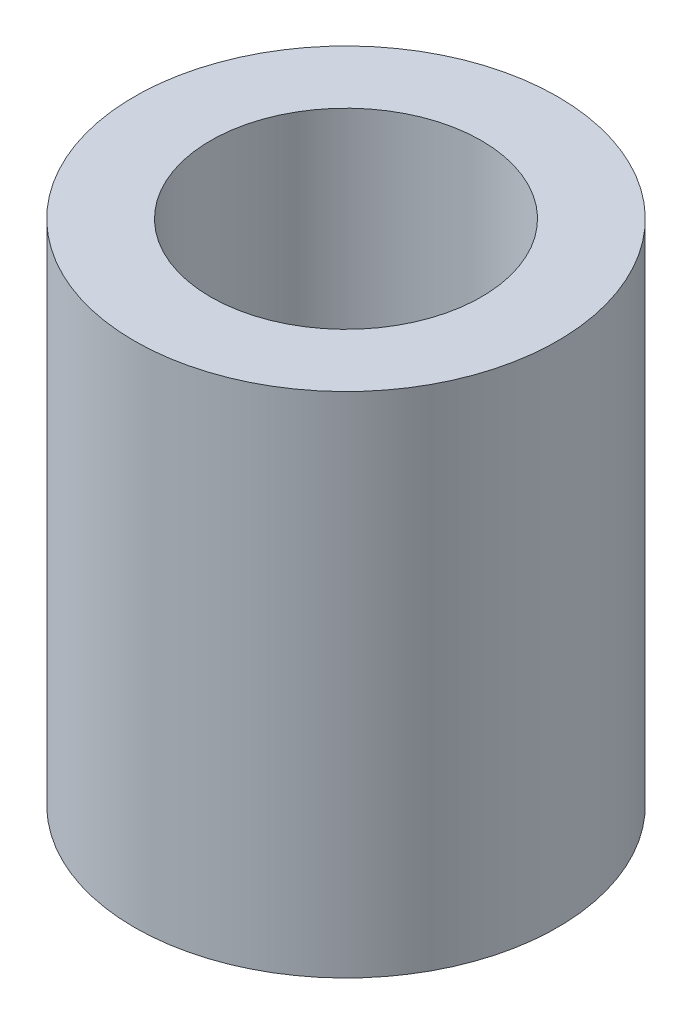
ISO-10303-21;
HEADER;
FILE_DESCRIPTION(('STEP AP214'),'2;1');
FILE_NAME('part.step','',(''),(''),'','','');
FILE_SCHEMA(('AUTOMOTIVE_DESIGN { 1 0 10303 214 1 1 1 1 }'));
ENDSEC;
DATA;
#1=APPLICATION_CONTEXT('core data for automotive mechanical design processes');
#2=APPLICATION_PROTOCOL_DEFINITION('international standard','automotive_design',2000,#1);
#3=PRODUCT_CONTEXT('',#1,'mechanical');
#4=PRODUCT('Part','Part','',(#3));
#5=PRODUCT_RELATED_PRODUCT_CATEGORY('part','',(#4));
#6=PRODUCT_DEFINITION_FORMATION('','',#4);
#7=PRODUCT_DEFINITION_CONTEXT('part definition',#1,'design');
#8=PRODUCT_DEFINITION('design','',#6,#7);
#9=PRODUCT_DEFINITION_SHAPE('','',#8);
#10=(LENGTH_UNIT() NAMED_UNIT(*) SI_UNIT(.MILLI.,.METRE.));
#11=(NAMED_UNIT(*) PLANE_ANGLE_UNIT() SI_UNIT($,.RADIAN.));
#12=(NAMED_UNIT(*) SI_UNIT($,.STERADIAN.) SOLID_ANGLE_UNIT());
#13=UNCERTAINTY_MEASURE_WITH_UNIT(LENGTH_MEASURE(1.E-05),#10,'distance_accuracy_value','');
#14=(GEOMETRIC_REPRESENTATION_CONTEXT(3) GLOBAL_UNCERTAINTY_ASSIGNED_CONTEXT((#13)) GLOBAL_UNIT_ASSIGNED_CONTEXT((#10,
#11,#12)) REPRESENTATION_CONTEXT('',''));
#15=CARTESIAN_POINT('',(0.,0.,0.));
#16=DIRECTION('',(0.,0.,1.));
#17=DIRECTION('',(1.,0.,0.));
#18=AXIS2_PLACEMENT_3D('',#15,#16,#17);
#19=CARTESIAN_POINT('',(0.,3.,0.));
#20=DIRECTION('',(0.,-1.,0.));
#21=DIRECTION('',(0.,0.,-1.));
#22=AXIS2_PLACEMENT_3D('',#19,#20,#21);
#23=CYLINDRICAL_SURFACE('',#22,2.5);
#24=CARTESIAN_POINT('',(0.,3.,0.));
#25=DIRECTION('',(0.,1.,0.));
#26=DIRECTION('',(0.,0.,1.));
#27=AXIS2_PLACEMENT_3D('',#24,#25,#26);
#28=CIRCLE('',#27,2.5);
#29=CARTESIAN_POINT('',(0.,3.,2.5));
#30=VERTEX_POINT('',#29);
#31=EDGE_CURVE('E10',#30,#30,#28,.T.);
#32=ORIENTED_EDGE('',*,*,#31,.F.);
#33=EDGE_LOOP('',(#32));
#34=FACE_BOUND('',#33,.T.);
#35=CARTESIAN_POINT('',(0.,-3.,0.));
#36=DIRECTION('',(0.,1.,0.));
#37=DIRECTION('',(0.,0.,1.));
#38=AXIS2_PLACEMENT_3D('',#35,#36,#37);
#39=CIRCLE('',#38,2.5);
#40=CARTESIAN_POINT('',(0.,-3.,2.5));
#41=VERTEX_POINT('',#40);
#42=EDGE_CURVE('E44',#41,#41,#39,.T.);
#43=ORIENTED_EDGE('',*,*,#42,.T.);
#44=EDGE_LOOP('',(#43));
#45=FACE_BOUND('',#44,.T.);
#46=ADVANCED_FACE('F41',(#34,#45),#23,.T.);
#47=CARTESIAN_POINT('',(0.,3.,0.));
#48=DIRECTION('',(0.,1.,0.));
#49=DIRECTION('',(0.,0.,1.));
#50=AXIS2_PLACEMENT_3D('',#47,#48,#49);
#51=PLANE('',#50);
#52=CARTESIAN_POINT('',(0.,3.,0.));
#53=DIRECTION('',(0.,1.,0.));
#54=DIRECTION('',(0.,0.,1.));
#55=AXIS2_PLACEMENT_3D('',#52,#53,#54);
#56=CIRCLE('',#55,1.6);
#57=CARTESIAN_POINT('',(0.,3.,1.6));
#58=VERTEX_POINT('',#57);
#59=EDGE_CURVE('E58',#58,#58,#56,.T.);
#60=ORIENTED_EDGE('',*,*,#59,.F.);
#61=EDGE_LOOP('',(#60));
#62=FACE_BOUND('',#61,.T.);
#63=ORIENTED_EDGE('',*,*,#31,.T.);
#64=EDGE_LOOP('',(#63));
#65=FACE_BOUND('',#64,.T.);
#66=ADVANCED_FACE('F65',(#62,#65),#51,.T.);
#67=CARTESIAN_POINT('',(0.,-3.,0.));
#68=DIRECTION('',(0.,1.,0.));
#69=DIRECTION('',(0.,0.,1.));
#70=AXIS2_PLACEMENT_3D('',#67,#68,#69);
#71=PLANE('',#70);
#72=CARTESIAN_POINT('',(0.,-3.,0.));
#73=DIRECTION('',(0.,1.,0.));
#74=DIRECTION('',(0.,0.,1.));
#75=AXIS2_PLACEMENT_3D('',#72,#73,#74);
#76=CIRCLE('',#75,1.6);
#77=CARTESIAN_POINT('',(0.,-3.,1.6));
#78=VERTEX_POINT('',#77);
#79=EDGE_CURVE('E53',#78,#78,#76,.T.);
#80=ORIENTED_EDGE('',*,*,#79,.T.);
#81=EDGE_LOOP('',(#80));
#82=FACE_BOUND('',#81,.T.);
#83=ORIENTED_EDGE('',*,*,#42,.F.);
#84=EDGE_LOOP('',(#83));
#85=FACE_BOUND('',#84,.T.);
#86=ADVANCED_FACE('F67',(#82,#85),#71,.F.);
#87=CARTESIAN_POINT('',(0.,3.,0.));
#88=DIRECTION('',(0.,1.,0.));
#89=DIRECTION('',(0.,0.,1.));
#90=AXIS2_PLACEMENT_3D('',#87,#88,#89);
#91=CYLINDRICAL_SURFACE('',#90,1.6);
#92=ORIENTED_EDGE('',*,*,#79,.F.);
#93=EDGE_LOOP('',(#92));
#94=FACE_BOUND('',#93,.T.);
#95=ORIENTED_EDGE('',*,*,#59,.T.);
#96=EDGE_LOOP('',(#95));
#97=FACE_BOUND('',#96,.T.);
#98=ADVANCED_FACE('F63',(#94,#97),#91,.F.);
#99=CLOSED_SHELL('',(#46,#66,#86,#98));
#100=MANIFOLD_SOLID_BREP('B2',#99);
#101=ADVANCED_BREP_SHAPE_REPRESENTATION('',(#18,#100),#14);
#102=SHAPE_DEFINITION_REPRESENTATION(#9,#101);
ENDSEC;
END-ISO-10303-21;
